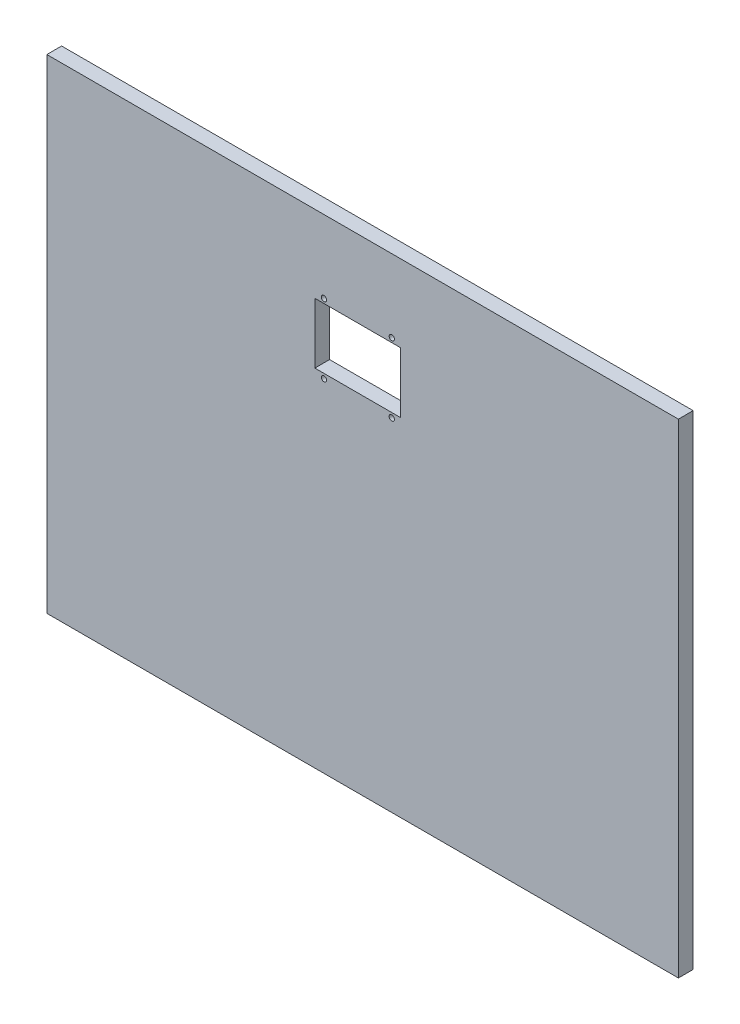
ISO-10303-21;
HEADER;
FILE_DESCRIPTION(('STEP AP214'),'2;1');
FILE_NAME('part.step','',(''),(''),'','','');
FILE_SCHEMA(('AUTOMOTIVE_DESIGN { 1 0 10303 214 1 1 1 1 }'));
ENDSEC;
DATA;
#1=APPLICATION_CONTEXT('core data for automotive mechanical design processes');
#2=APPLICATION_PROTOCOL_DEFINITION('international standard','automotive_design',2000,#1);
#3=PRODUCT_CONTEXT('',#1,'mechanical');
#4=PRODUCT('Part','Part','',(#3));
#5=PRODUCT_RELATED_PRODUCT_CATEGORY('part','',(#4));
#6=PRODUCT_DEFINITION_FORMATION('','',#4);
#7=PRODUCT_DEFINITION_CONTEXT('part definition',#1,'design');
#8=PRODUCT_DEFINITION('design','',#6,#7);
#9=PRODUCT_DEFINITION_SHAPE('','',#8);
#10=(LENGTH_UNIT() NAMED_UNIT(*) SI_UNIT(.MILLI.,.METRE.));
#11=(NAMED_UNIT(*) PLANE_ANGLE_UNIT() SI_UNIT($,.RADIAN.));
#12=(NAMED_UNIT(*) SI_UNIT($,.STERADIAN.) SOLID_ANGLE_UNIT());
#13=UNCERTAINTY_MEASURE_WITH_UNIT(LENGTH_MEASURE(1.E-05),#10,'distance_accuracy_value','');
#14=(GEOMETRIC_REPRESENTATION_CONTEXT(3) GLOBAL_UNCERTAINTY_ASSIGNED_CONTEXT((#13)) GLOBAL_UNIT_ASSIGNED_CONTEXT((#10,
#11,#12)) REPRESENTATION_CONTEXT('',''));
#15=CARTESIAN_POINT('',(0.,0.,0.));
#16=DIRECTION('',(0.,0.,1.));
#17=DIRECTION('',(1.,0.,0.));
#18=AXIS2_PLACEMENT_3D('',#15,#16,#17);
#19=CARTESIAN_POINT('',(0.,0.,5.));
#20=DIRECTION('',(0.,0.,-1.));
#21=DIRECTION('',(-1.,0.,0.));
#22=AXIS2_PLACEMENT_3D('',#19,#20,#21);
#23=PLANE('',#22);
#24=CARTESIAN_POINT('',(93.9009384156509,115.791572103838,5.));
#25=DIRECTION('',(0.,0.,1.));
#26=DIRECTION('',(1.,0.,0.));
#27=AXIS2_PLACEMENT_3D('',#24,#25,#26);
#28=CIRCLE('',#27,0.900000000000003);
#29=CARTESIAN_POINT('',(94.8009384156509,115.791572103838,5.));
#30=VERTEX_POINT('',#29);
#31=EDGE_CURVE('E137',#30,#30,#28,.T.);
#32=ORIENTED_EDGE('',*,*,#31,.F.);
#33=EDGE_LOOP('',(#32));
#34=FACE_BOUND('',#33,.T.);
#35=CARTESIAN_POINT('',(116.857391746103,115.791572103838,5.));
#36=DIRECTION('',(0.,0.,1.));
#37=DIRECTION('',(1.,0.,0.));
#38=AXIS2_PLACEMENT_3D('',#35,#36,#37);
#39=CIRCLE('',#38,0.900000000000003);
#40=CARTESIAN_POINT('',(117.757391746103,115.791572103838,5.));
#41=VERTEX_POINT('',#40);
#42=EDGE_CURVE('E143',#41,#41,#39,.T.);
#43=ORIENTED_EDGE('',*,*,#42,.F.);
#44=EDGE_LOOP('',(#43));
#45=FACE_BOUND('',#44,.T.);
#46=CARTESIAN_POINT('',(116.881957078688,139.347906794937,5.));
#47=DIRECTION('',(0.,0.,1.));
#48=DIRECTION('',(1.,0.,0.));
#49=AXIS2_PLACEMENT_3D('',#46,#47,#48);
#50=CIRCLE('',#49,0.90000000000002);
#51=CARTESIAN_POINT('',(117.781957078688,139.347906794937,5.));
#52=VERTEX_POINT('',#51);
#53=EDGE_CURVE('E149',#52,#52,#50,.T.);
#54=ORIENTED_EDGE('',*,*,#53,.F.);
#55=EDGE_LOOP('',(#54));
#56=FACE_BOUND('',#55,.T.);
#57=CARTESIAN_POINT('',(93.9009384156509,139.347906794937,5.));
#58=DIRECTION('',(0.,0.,1.));
#59=DIRECTION('',(1.,0.,0.));
#60=AXIS2_PLACEMENT_3D('',#57,#58,#59);
#61=CIRCLE('',#60,0.90000000000002);
#62=CARTESIAN_POINT('',(94.8009384156509,139.347906794937,5.));
#63=VERTEX_POINT('',#62);
#64=EDGE_CURVE('E155',#63,#63,#61,.T.);
#65=ORIENTED_EDGE('',*,*,#64,.F.);
#66=EDGE_LOOP('',(#65));
#67=FACE_BOUND('',#66,.T.);
#68=DIRECTION('',(0.,-1.,0.));
#69=VECTOR('',#68,1.);
#70=CARTESIAN_POINT('',(0.,0.,5.));
#71=LINE('',#70,#69);
#72=CARTESIAN_POINT('',(0.,164.,5.));
#73=VERTEX_POINT('',#72);
#74=CARTESIAN_POINT('',(0.,0.,5.));
#75=VERTEX_POINT('',#74);
#76=EDGE_CURVE('E161',#73,#75,#71,.T.);
#77=ORIENTED_EDGE('',*,*,#76,.T.);
#78=DIRECTION('',(1.,0.,0.));
#79=VECTOR('',#78,1.);
#80=CARTESIAN_POINT('',(0.,0.,5.));
#81=LINE('',#80,#79);
#82=CARTESIAN_POINT('',(214.,0.,5.));
#83=VERTEX_POINT('',#82);
#84=EDGE_CURVE('E164',#75,#83,#81,.T.);
#85=ORIENTED_EDGE('',*,*,#84,.T.);
#86=DIRECTION('',(0.,1.,0.));
#87=VECTOR('',#86,1.);
#88=CARTESIAN_POINT('',(214.,0.,5.));
#89=LINE('',#88,#87);
#90=CARTESIAN_POINT('',(214.,164.,5.));
#91=VERTEX_POINT('',#90);
#92=EDGE_CURVE('E167',#83,#91,#89,.T.);
#93=ORIENTED_EDGE('',*,*,#92,.T.);
#94=DIRECTION('',(-1.,0.,0.));
#95=VECTOR('',#94,1.);
#96=CARTESIAN_POINT('',(0.,164.,5.));
#97=LINE('',#96,#95);
#98=EDGE_CURVE('E169',#91,#73,#97,.T.);
#99=ORIENTED_EDGE('',*,*,#98,.T.);
#100=EDGE_LOOP('',(#77,#85,#93,#99));
#101=FACE_BOUND('',#100,.T.);
#102=DIRECTION('',(0.,1.,0.));
#103=VECTOR('',#102,1.);
#104=CARTESIAN_POINT('',(119.809972599643,137.88320809239,5.));
#105=LINE('',#104,#103);
#106=CARTESIAN_POINT('',(119.809972599643,117.38320809239,5.));
#107=VERTEX_POINT('',#106);
#108=CARTESIAN_POINT('',(119.809972599643,137.88320809239,5.));
#109=VERTEX_POINT('',#108);
#110=EDGE_CURVE('E101',#107,#109,#105,.T.);
#111=ORIENTED_EDGE('',*,*,#110,.F.);
#112=DIRECTION('',(1.,0.,0.));
#113=VECTOR('',#112,1.);
#114=CARTESIAN_POINT('',(119.809972599643,117.38320809239,5.));
#115=LINE('',#114,#113);
#116=CARTESIAN_POINT('',(90.8099725996431,117.38320809239,5.));
#117=VERTEX_POINT('',#116);
#118=EDGE_CURVE('E123',#117,#107,#115,.T.);
#119=ORIENTED_EDGE('',*,*,#118,.F.);
#120=DIRECTION('',(0.,-1.,0.));
#121=VECTOR('',#120,1.);
#122=CARTESIAN_POINT('',(90.8099725996431,137.88320809239,5.));
#123=LINE('',#122,#121);
#124=CARTESIAN_POINT('',(90.8099725996431,137.88320809239,5.));
#125=VERTEX_POINT('',#124);
#126=EDGE_CURVE('E121',#125,#117,#123,.T.);
#127=ORIENTED_EDGE('',*,*,#126,.F.);
#128=DIRECTION('',(-1.,0.,0.));
#129=VECTOR('',#128,1.);
#130=CARTESIAN_POINT('',(119.809972599643,137.88320809239,5.));
#131=LINE('',#130,#129);
#132=EDGE_CURVE('E109',#109,#125,#131,.T.);
#133=ORIENTED_EDGE('',*,*,#132,.F.);
#134=EDGE_LOOP('',(#111,#119,#127,#133));
#135=FACE_BOUND('',#134,.T.);
#136=ADVANCED_FACE('F36',(#34,#45,#56,#67,#101,#135),#23,.F.);
#137=CARTESIAN_POINT('',(0.,0.,0.));
#138=DIRECTION('',(0.,0.,-1.));
#139=DIRECTION('',(-1.,0.,0.));
#140=AXIS2_PLACEMENT_3D('',#137,#138,#139);
#141=PLANE('',#140);
#142=CARTESIAN_POINT('',(116.857391746103,115.791572103838,0.));
#143=DIRECTION('',(0.,0.,1.));
#144=DIRECTION('',(1.,0.,0.));
#145=AXIS2_PLACEMENT_3D('',#142,#143,#144);
#146=CIRCLE('',#145,0.900000000000003);
#147=CARTESIAN_POINT('',(117.757391746103,115.791572103838,0.));
#148=VERTEX_POINT('',#147);
#149=EDGE_CURVE('E140',#148,#148,#146,.T.);
#150=ORIENTED_EDGE('',*,*,#149,.T.);
#151=EDGE_LOOP('',(#150));
#152=FACE_BOUND('',#151,.T.);
#153=CARTESIAN_POINT('',(93.9009384156509,139.347906794937,0.));
#154=DIRECTION('',(0.,0.,1.));
#155=DIRECTION('',(1.,0.,0.));
#156=AXIS2_PLACEMENT_3D('',#153,#154,#155);
#157=CIRCLE('',#156,0.90000000000002);
#158=CARTESIAN_POINT('',(94.8009384156509,139.347906794937,0.));
#159=VERTEX_POINT('',#158);
#160=EDGE_CURVE('E152',#159,#159,#157,.T.);
#161=ORIENTED_EDGE('',*,*,#160,.T.);
#162=EDGE_LOOP('',(#161));
#163=FACE_BOUND('',#162,.T.);
#164=DIRECTION('',(0.,-1.,0.));
#165=VECTOR('',#164,1.);
#166=CARTESIAN_POINT('',(0.,0.,0.));
#167=LINE('',#166,#165);
#168=CARTESIAN_POINT('',(0.,164.,0.));
#169=VERTEX_POINT('',#168);
#170=CARTESIAN_POINT('',(0.,0.,0.));
#171=VERTEX_POINT('',#170);
#172=EDGE_CURVE('E158',#169,#171,#167,.T.);
#173=ORIENTED_EDGE('',*,*,#172,.F.);
#174=DIRECTION('',(-1.,0.,0.));
#175=VECTOR('',#174,1.);
#176=CARTESIAN_POINT('',(0.,164.,0.));
#177=LINE('',#176,#175);
#178=CARTESIAN_POINT('',(214.,164.,0.));
#179=VERTEX_POINT('',#178);
#180=EDGE_CURVE('E165',#179,#169,#177,.T.);
#181=ORIENTED_EDGE('',*,*,#180,.F.);
#182=DIRECTION('',(0.,1.,0.));
#183=VECTOR('',#182,1.);
#184=CARTESIAN_POINT('',(214.,0.,0.));
#185=LINE('',#184,#183);
#186=CARTESIAN_POINT('',(214.,0.,0.));
#187=VERTEX_POINT('',#186);
#188=EDGE_CURVE('E176',#187,#179,#185,.T.);
#189=ORIENTED_EDGE('',*,*,#188,.F.);
#190=DIRECTION('',(1.,0.,0.));
#191=VECTOR('',#190,1.);
#192=CARTESIAN_POINT('',(0.,0.,0.));
#193=LINE('',#192,#191);
#194=EDGE_CURVE('E174',#171,#187,#193,.T.);
#195=ORIENTED_EDGE('',*,*,#194,.F.);
#196=EDGE_LOOP('',(#173,#181,#189,#195));
#197=FACE_BOUND('',#196,.T.);
#198=CARTESIAN_POINT('',(116.881957078688,139.347906794937,0.));
#199=DIRECTION('',(0.,0.,1.));
#200=DIRECTION('',(1.,0.,0.));
#201=AXIS2_PLACEMENT_3D('',#198,#199,#200);
#202=CIRCLE('',#201,0.90000000000002);
#203=CARTESIAN_POINT('',(117.781957078688,139.347906794937,0.));
#204=VERTEX_POINT('',#203);
#205=EDGE_CURVE('E146',#204,#204,#202,.T.);
#206=ORIENTED_EDGE('',*,*,#205,.T.);
#207=EDGE_LOOP('',(#206));
#208=FACE_BOUND('',#207,.T.);
#209=CARTESIAN_POINT('',(93.9009384156509,115.791572103838,0.));
#210=DIRECTION('',(0.,0.,1.));
#211=DIRECTION('',(1.,0.,0.));
#212=AXIS2_PLACEMENT_3D('',#209,#210,#211);
#213=CIRCLE('',#212,0.900000000000003);
#214=CARTESIAN_POINT('',(94.8009384156509,115.791572103838,0.));
#215=VERTEX_POINT('',#214);
#216=EDGE_CURVE('E117',#215,#215,#213,.T.);
#217=ORIENTED_EDGE('',*,*,#216,.T.);
#218=EDGE_LOOP('',(#217));
#219=FACE_BOUND('',#218,.T.);
#220=DIRECTION('',(1.,0.,0.));
#221=VECTOR('',#220,1.);
#222=CARTESIAN_POINT('',(119.809972599643,117.38320809239,0.));
#223=LINE('',#222,#221);
#224=CARTESIAN_POINT('',(90.8099725996431,117.38320809239,0.));
#225=VERTEX_POINT('',#224);
#226=CARTESIAN_POINT('',(119.809972599643,117.38320809239,0.));
#227=VERTEX_POINT('',#226);
#228=EDGE_CURVE('E110',#225,#227,#223,.T.);
#229=ORIENTED_EDGE('',*,*,#228,.T.);
#230=DIRECTION('',(0.,1.,0.));
#231=VECTOR('',#230,1.);
#232=CARTESIAN_POINT('',(119.809972599643,137.88320809239,0.));
#233=LINE('',#232,#231);
#234=CARTESIAN_POINT('',(119.809972599643,137.88320809239,0.));
#235=VERTEX_POINT('',#234);
#236=EDGE_CURVE('E59',#227,#235,#233,.T.);
#237=ORIENTED_EDGE('',*,*,#236,.T.);
#238=DIRECTION('',(-1.,0.,0.));
#239=VECTOR('',#238,1.);
#240=CARTESIAN_POINT('',(119.809972599643,137.88320809239,0.));
#241=LINE('',#240,#239);
#242=CARTESIAN_POINT('',(90.8099725996431,137.88320809239,0.));
#243=VERTEX_POINT('',#242);
#244=EDGE_CURVE('E116',#235,#243,#241,.T.);
#245=ORIENTED_EDGE('',*,*,#244,.T.);
#246=DIRECTION('',(0.,-1.,0.));
#247=VECTOR('',#246,1.);
#248=CARTESIAN_POINT('',(90.8099725996431,137.88320809239,0.));
#249=LINE('',#248,#247);
#250=EDGE_CURVE('E129',#243,#225,#249,.T.);
#251=ORIENTED_EDGE('',*,*,#250,.T.);
#252=EDGE_LOOP('',(#229,#237,#245,#251));
#253=FACE_BOUND('',#252,.T.);
#254=ADVANCED_FACE('F194',(#152,#163,#197,#208,#219,#253),#141,.T.);
#255=CARTESIAN_POINT('',(0.,0.,5.));
#256=DIRECTION('',(1.,0.,0.));
#257=DIRECTION('',(0.,0.,-1.));
#258=AXIS2_PLACEMENT_3D('',#255,#256,#257);
#259=PLANE('',#258);
#260=ORIENTED_EDGE('',*,*,#172,.T.);
#261=DIRECTION('',(0.,0.,-1.));
#262=VECTOR('',#261,1.);
#263=CARTESIAN_POINT('',(0.,0.,5.));
#264=LINE('',#263,#262);
#265=EDGE_CURVE('E11',#75,#171,#264,.T.);
#266=ORIENTED_EDGE('',*,*,#265,.F.);
#267=ORIENTED_EDGE('',*,*,#76,.F.);
#268=DIRECTION('',(0.,0.,-1.));
#269=VECTOR('',#268,1.);
#270=CARTESIAN_POINT('',(0.,164.,5.));
#271=LINE('',#270,#269);
#272=EDGE_CURVE('E171',#73,#169,#271,.T.);
#273=ORIENTED_EDGE('',*,*,#272,.T.);
#274=EDGE_LOOP('',(#260,#266,#267,#273));
#275=FACE_BOUND('',#274,.T.);
#276=ADVANCED_FACE('F38',(#275),#259,.F.);
#277=CARTESIAN_POINT('',(0.,0.,5.));
#278=DIRECTION('',(0.,1.,0.));
#279=DIRECTION('',(0.,0.,1.));
#280=AXIS2_PLACEMENT_3D('',#277,#278,#279);
#281=PLANE('',#280);
#282=ORIENTED_EDGE('',*,*,#194,.T.);
#283=DIRECTION('',(0.,0.,-1.));
#284=VECTOR('',#283,1.);
#285=CARTESIAN_POINT('',(214.,0.,5.));
#286=LINE('',#285,#284);
#287=EDGE_CURVE('E44',#83,#187,#286,.T.);
#288=ORIENTED_EDGE('',*,*,#287,.F.);
#289=ORIENTED_EDGE('',*,*,#84,.F.);
#290=ORIENTED_EDGE('',*,*,#265,.T.);
#291=EDGE_LOOP('',(#282,#288,#289,#290));
#292=FACE_BOUND('',#291,.T.);
#293=ADVANCED_FACE('F204',(#292),#281,.F.);
#294=CARTESIAN_POINT('',(214.,0.,5.));
#295=DIRECTION('',(-1.,0.,0.));
#296=DIRECTION('',(0.,0.,1.));
#297=AXIS2_PLACEMENT_3D('',#294,#295,#296);
#298=PLANE('',#297);
#299=ORIENTED_EDGE('',*,*,#188,.T.);
#300=DIRECTION('',(0.,0.,-1.));
#301=VECTOR('',#300,1.);
#302=CARTESIAN_POINT('',(214.,164.,5.));
#303=LINE('',#302,#301);
#304=EDGE_CURVE('E181',#91,#179,#303,.T.);
#305=ORIENTED_EDGE('',*,*,#304,.F.);
#306=ORIENTED_EDGE('',*,*,#92,.F.);
#307=ORIENTED_EDGE('',*,*,#287,.T.);
#308=EDGE_LOOP('',(#299,#305,#306,#307));
#309=FACE_BOUND('',#308,.T.);
#310=ADVANCED_FACE('F188',(#309),#298,.F.);
#311=CARTESIAN_POINT('',(0.,164.,5.));
#312=DIRECTION('',(0.,-1.,0.));
#313=DIRECTION('',(0.,0.,-1.));
#314=AXIS2_PLACEMENT_3D('',#311,#312,#313);
#315=PLANE('',#314);
#316=ORIENTED_EDGE('',*,*,#180,.T.);
#317=ORIENTED_EDGE('',*,*,#272,.F.);
#318=ORIENTED_EDGE('',*,*,#98,.F.);
#319=ORIENTED_EDGE('',*,*,#304,.T.);
#320=EDGE_LOOP('',(#316,#317,#318,#319));
#321=FACE_BOUND('',#320,.T.);
#322=ADVANCED_FACE('F198',(#321),#315,.F.);
#323=CARTESIAN_POINT('',(93.9009384156509,139.347906794937,5.));
#324=DIRECTION('',(0.,0.,-1.));
#325=DIRECTION('',(-1.,0.,0.));
#326=AXIS2_PLACEMENT_3D('',#323,#324,#325);
#327=CYLINDRICAL_SURFACE('',#326,0.90000000000002);
#328=ORIENTED_EDGE('',*,*,#64,.T.);
#329=EDGE_LOOP('',(#328));
#330=FACE_BOUND('',#329,.T.);
#331=ORIENTED_EDGE('',*,*,#160,.F.);
#332=EDGE_LOOP('',(#331));
#333=FACE_BOUND('',#332,.T.);
#334=ADVANCED_FACE('F222',(#330,#333),#327,.F.);
#335=CARTESIAN_POINT('',(116.881957078688,139.347906794937,5.));
#336=DIRECTION('',(0.,0.,-1.));
#337=DIRECTION('',(-1.,0.,0.));
#338=AXIS2_PLACEMENT_3D('',#335,#336,#337);
#339=CYLINDRICAL_SURFACE('',#338,0.90000000000002);
#340=ORIENTED_EDGE('',*,*,#53,.T.);
#341=EDGE_LOOP('',(#340));
#342=FACE_BOUND('',#341,.T.);
#343=ORIENTED_EDGE('',*,*,#205,.F.);
#344=EDGE_LOOP('',(#343));
#345=FACE_BOUND('',#344,.T.);
#346=ADVANCED_FACE('F229',(#342,#345),#339,.F.);
#347=CARTESIAN_POINT('',(116.857391746103,115.791572103838,5.));
#348=DIRECTION('',(0.,0.,-1.));
#349=DIRECTION('',(-1.,0.,0.));
#350=AXIS2_PLACEMENT_3D('',#347,#348,#349);
#351=CYLINDRICAL_SURFACE('',#350,0.900000000000003);
#352=ORIENTED_EDGE('',*,*,#42,.T.);
#353=EDGE_LOOP('',(#352));
#354=FACE_BOUND('',#353,.T.);
#355=ORIENTED_EDGE('',*,*,#149,.F.);
#356=EDGE_LOOP('',(#355));
#357=FACE_BOUND('',#356,.T.);
#358=ADVANCED_FACE('F234',(#354,#357),#351,.F.);
#359=CARTESIAN_POINT('',(93.9009384156509,115.791572103838,5.));
#360=DIRECTION('',(0.,0.,-1.));
#361=DIRECTION('',(-1.,0.,0.));
#362=AXIS2_PLACEMENT_3D('',#359,#360,#361);
#363=CYLINDRICAL_SURFACE('',#362,0.900000000000003);
#364=ORIENTED_EDGE('',*,*,#31,.T.);
#365=EDGE_LOOP('',(#364));
#366=FACE_BOUND('',#365,.T.);
#367=ORIENTED_EDGE('',*,*,#216,.F.);
#368=EDGE_LOOP('',(#367));
#369=FACE_BOUND('',#368,.T.);
#370=ADVANCED_FACE('F244',(#366,#369),#363,.F.);
#371=CARTESIAN_POINT('',(119.809972599643,137.88320809239,5.));
#372=DIRECTION('',(-1.,0.,0.));
#373=DIRECTION('',(0.,-1.,0.));
#374=AXIS2_PLACEMENT_3D('',#371,#372,#373);
#375=PLANE('',#374);
#376=ORIENTED_EDGE('',*,*,#236,.F.);
#377=DIRECTION('',(0.,0.,-1.));
#378=VECTOR('',#377,1.);
#379=CARTESIAN_POINT('',(119.809972599643,117.38320809239,5.));
#380=LINE('',#379,#378);
#381=EDGE_CURVE('E105',#107,#227,#380,.T.);
#382=ORIENTED_EDGE('',*,*,#381,.F.);
#383=ORIENTED_EDGE('',*,*,#110,.T.);
#384=DIRECTION('',(0.,0.,-1.));
#385=VECTOR('',#384,1.);
#386=CARTESIAN_POINT('',(119.809972599643,137.88320809239,5.));
#387=LINE('',#386,#385);
#388=EDGE_CURVE('E104',#109,#235,#387,.T.);
#389=ORIENTED_EDGE('',*,*,#388,.T.);
#390=EDGE_LOOP('',(#376,#382,#383,#389));
#391=FACE_BOUND('',#390,.T.);
#392=ADVANCED_FACE('F103',(#391),#375,.T.);
#393=CARTESIAN_POINT('',(119.809972599643,137.88320809239,5.));
#394=DIRECTION('',(0.,-1.,0.));
#395=DIRECTION('',(0.,0.,-1.));
#396=AXIS2_PLACEMENT_3D('',#393,#394,#395);
#397=PLANE('',#396);
#398=ORIENTED_EDGE('',*,*,#244,.F.);
#399=ORIENTED_EDGE('',*,*,#388,.F.);
#400=ORIENTED_EDGE('',*,*,#132,.T.);
#401=DIRECTION('',(0.,0.,-1.));
#402=VECTOR('',#401,1.);
#403=CARTESIAN_POINT('',(90.8099725996431,137.88320809239,5.));
#404=LINE('',#403,#402);
#405=EDGE_CURVE('E118',#125,#243,#404,.T.);
#406=ORIENTED_EDGE('',*,*,#405,.T.);
#407=EDGE_LOOP('',(#398,#399,#400,#406));
#408=FACE_BOUND('',#407,.T.);
#409=ADVANCED_FACE('F113',(#408),#397,.T.);
#410=CARTESIAN_POINT('',(90.8099725996431,137.88320809239,5.));
#411=DIRECTION('',(1.,0.,0.));
#412=DIRECTION('',(0.,1.,0.));
#413=AXIS2_PLACEMENT_3D('',#410,#411,#412);
#414=PLANE('',#413);
#415=ORIENTED_EDGE('',*,*,#250,.F.);
#416=ORIENTED_EDGE('',*,*,#405,.F.);
#417=ORIENTED_EDGE('',*,*,#126,.T.);
#418=DIRECTION('',(0.,0.,-1.));
#419=VECTOR('',#418,1.);
#420=CARTESIAN_POINT('',(90.8099725996431,117.38320809239,5.));
#421=LINE('',#420,#419);
#422=EDGE_CURVE('E51',#117,#225,#421,.T.);
#423=ORIENTED_EDGE('',*,*,#422,.T.);
#424=EDGE_LOOP('',(#415,#416,#417,#423));
#425=FACE_BOUND('',#424,.T.);
#426=ADVANCED_FACE('F256',(#425),#414,.T.);
#427=CARTESIAN_POINT('',(119.809972599643,117.38320809239,5.));
#428=DIRECTION('',(0.,1.,0.));
#429=DIRECTION('',(-1.,0.,0.));
#430=AXIS2_PLACEMENT_3D('',#427,#428,#429);
#431=PLANE('',#430);
#432=ORIENTED_EDGE('',*,*,#228,.F.);
#433=ORIENTED_EDGE('',*,*,#422,.F.);
#434=ORIENTED_EDGE('',*,*,#118,.T.);
#435=ORIENTED_EDGE('',*,*,#381,.T.);
#436=EDGE_LOOP('',(#432,#433,#434,#435));
#437=FACE_BOUND('',#436,.T.);
#438=ADVANCED_FACE('F259',(#437),#431,.T.);
#439=CLOSED_SHELL('',(#136,#254,#276,#293,#310,#322,#334,#346,#358,#370,#392,#409,#426,#438));
#440=MANIFOLD_SOLID_BREP('B2',#439);
#441=ADVANCED_BREP_SHAPE_REPRESENTATION('',(#18,#440),#14);
#442=SHAPE_DEFINITION_REPRESENTATION(#9,#441);
ENDSEC;
END-ISO-10303-21;
